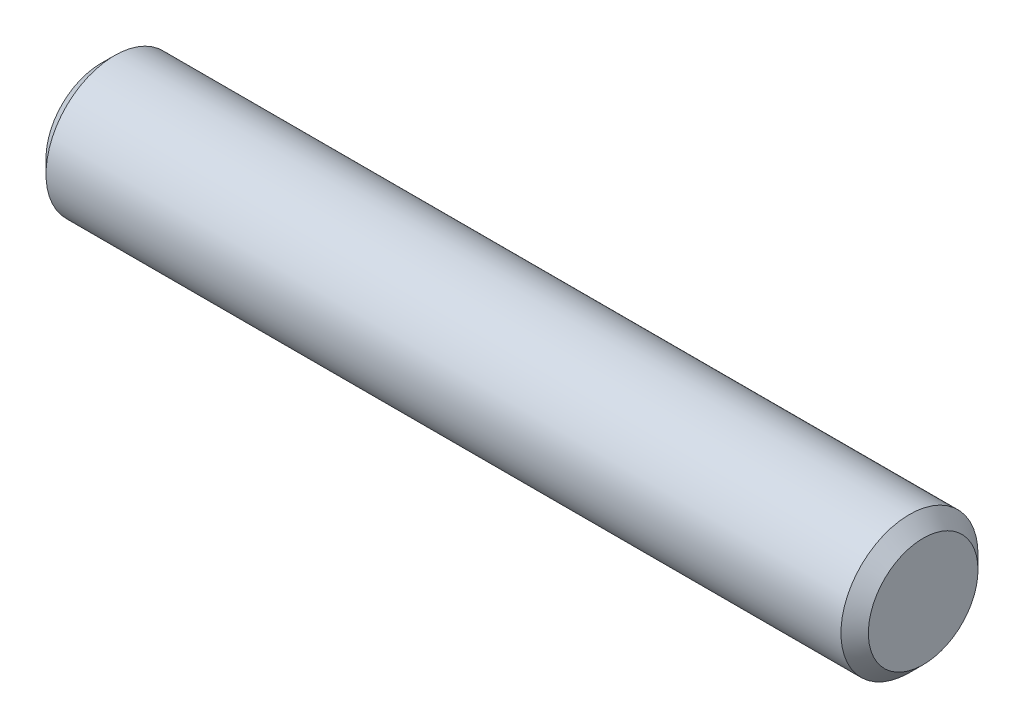
ISO-10303-21;
HEADER;
FILE_DESCRIPTION(('STEP AP214'),'2;1');
FILE_NAME('part.step','',(''),(''),'','','');
FILE_SCHEMA(('AUTOMOTIVE_DESIGN { 1 0 10303 214 1 1 1 1 }'));
ENDSEC;
DATA;
#1=APPLICATION_CONTEXT('core data for automotive mechanical design processes');
#2=APPLICATION_PROTOCOL_DEFINITION('international standard','automotive_design',2000,#1);
#3=PRODUCT_CONTEXT('',#1,'mechanical');
#4=PRODUCT('Part','Part','',(#3));
#5=PRODUCT_RELATED_PRODUCT_CATEGORY('part','',(#4));
#6=PRODUCT_DEFINITION_FORMATION('','',#4);
#7=PRODUCT_DEFINITION_CONTEXT('part definition',#1,'design');
#8=PRODUCT_DEFINITION('design','',#6,#7);
#9=PRODUCT_DEFINITION_SHAPE('','',#8);
#10=(LENGTH_UNIT() NAMED_UNIT(*) SI_UNIT(.MILLI.,.METRE.));
#11=(NAMED_UNIT(*) PLANE_ANGLE_UNIT() SI_UNIT($,.RADIAN.));
#12=(NAMED_UNIT(*) SI_UNIT($,.STERADIAN.) SOLID_ANGLE_UNIT());
#13=UNCERTAINTY_MEASURE_WITH_UNIT(LENGTH_MEASURE(1.E-05),#10,'distance_accuracy_value','');
#14=(GEOMETRIC_REPRESENTATION_CONTEXT(3) GLOBAL_UNCERTAINTY_ASSIGNED_CONTEXT((#13)) GLOBAL_UNIT_ASSIGNED_CONTEXT((#10,
#11,#12)) REPRESENTATION_CONTEXT('',''));
#15=CARTESIAN_POINT('',(0.,0.,0.));
#16=DIRECTION('',(0.,0.,1.));
#17=DIRECTION('',(1.,0.,0.));
#18=AXIS2_PLACEMENT_3D('',#15,#16,#17);
#19=CARTESIAN_POINT('',(-9.525,0.,0.));
#20=DIRECTION('',(1.,0.,0.));
#21=DIRECTION('',(0.,0.,-1.));
#22=AXIS2_PLACEMENT_3D('',#19,#20,#21);
#23=CYLINDRICAL_SURFACE('',#22,1.5875);
#24=CARTESIAN_POINT('',(9.2075,0.,0.));
#25=DIRECTION('',(1.,0.,0.));
#26=DIRECTION('',(0.,0.,-1.));
#27=AXIS2_PLACEMENT_3D('',#24,#25,#26);
#28=CIRCLE('',#27,1.5875);
#29=CARTESIAN_POINT('',(9.2075,0.,-1.5875));
#30=VERTEX_POINT('',#29);
#31=EDGE_CURVE('E39',#30,#30,#28,.F.);
#32=ORIENTED_EDGE('',*,*,#31,.T.);
#33=EDGE_LOOP('',(#32));
#34=FACE_BOUND('',#33,.T.);
#35=CARTESIAN_POINT('',(-9.20750000000001,0.,0.));
#36=DIRECTION('',(1.,0.,0.));
#37=DIRECTION('',(0.,0.,-1.));
#38=AXIS2_PLACEMENT_3D('',#35,#36,#37);
#39=CIRCLE('',#38,1.5875);
#40=CARTESIAN_POINT('',(-9.20750000000001,0.,-1.5875));
#41=VERTEX_POINT('',#40);
#42=EDGE_CURVE('E43',#41,#41,#39,.T.);
#43=ORIENTED_EDGE('',*,*,#42,.T.);
#44=EDGE_LOOP('',(#43));
#45=FACE_BOUND('',#44,.T.);
#46=ADVANCED_FACE('F32',(#34,#45),#23,.T.);
#47=CARTESIAN_POINT('',(-9.525,0.,0.));
#48=DIRECTION('',(1.,0.,0.));
#49=DIRECTION('',(0.,0.,-1.));
#50=AXIS2_PLACEMENT_3D('',#47,#48,#49);
#51=PLANE('',#50);
#52=CARTESIAN_POINT('',(-9.525,0.,0.));
#53=DIRECTION('',(1.,0.,0.));
#54=DIRECTION('',(0.,0.,-1.));
#55=AXIS2_PLACEMENT_3D('',#52,#53,#54);
#56=CIRCLE('',#55,1.27);
#57=CARTESIAN_POINT('',(-9.525,0.,-1.27));
#58=VERTEX_POINT('',#57);
#59=EDGE_CURVE('E10',#58,#58,#56,.F.);
#60=ORIENTED_EDGE('',*,*,#59,.T.);
#61=EDGE_LOOP('',(#60));
#62=FACE_BOUND('',#61,.T.);
#63=ADVANCED_FACE('F63',(#62),#51,.F.);
#64=CARTESIAN_POINT('',(9.525,0.,0.));
#65=DIRECTION('',(1.,0.,0.));
#66=DIRECTION('',(0.,0.,-1.));
#67=AXIS2_PLACEMENT_3D('',#64,#65,#66);
#68=PLANE('',#67);
#69=CARTESIAN_POINT('',(9.525,0.,0.));
#70=DIRECTION('',(1.,0.,0.));
#71=DIRECTION('',(0.,0.,-1.));
#72=AXIS2_PLACEMENT_3D('',#69,#70,#71);
#73=CIRCLE('',#72,1.27);
#74=CARTESIAN_POINT('',(9.525,0.,-1.27));
#75=VERTEX_POINT('',#74);
#76=EDGE_CURVE('E47',#75,#75,#73,.T.);
#77=ORIENTED_EDGE('',*,*,#76,.T.);
#78=EDGE_LOOP('',(#77));
#79=FACE_BOUND('',#78,.T.);
#80=ADVANCED_FACE('F53',(#79),#68,.T.);
#81=CARTESIAN_POINT('',(9.525,0.,0.));
#82=DIRECTION('',(-1.,0.,0.));
#83=DIRECTION('',(0.,0.,1.));
#84=AXIS2_PLACEMENT_3D('',#81,#82,#83);
#85=CONICAL_SURFACE('',#84,1.27,0.78539816339745);
#86=ORIENTED_EDGE('',*,*,#31,.F.);
#87=EDGE_LOOP('',(#86));
#88=FACE_BOUND('',#87,.T.);
#89=ORIENTED_EDGE('',*,*,#76,.F.);
#90=EDGE_LOOP('',(#89));
#91=FACE_BOUND('',#90,.T.);
#92=ADVANCED_FACE('F55',(#88,#91),#85,.T.);
#93=CARTESIAN_POINT('',(-9.20750000000001,0.,0.));
#94=DIRECTION('',(1.,0.,0.));
#95=DIRECTION('',(0.,0.,-1.));
#96=AXIS2_PLACEMENT_3D('',#93,#94,#95);
#97=CONICAL_SURFACE('',#96,1.5875,0.78539816339745);
#98=ORIENTED_EDGE('',*,*,#59,.F.);
#99=EDGE_LOOP('',(#98));
#100=FACE_BOUND('',#99,.T.);
#101=ORIENTED_EDGE('',*,*,#42,.F.);
#102=EDGE_LOOP('',(#101));
#103=FACE_BOUND('',#102,.T.);
#104=ADVANCED_FACE('F34',(#100,#103),#97,.T.);
#105=CLOSED_SHELL('',(#46,#63,#80,#92,#104));
#106=MANIFOLD_SOLID_BREP('B2',#105);
#107=ADVANCED_BREP_SHAPE_REPRESENTATION('',(#18,#106),#14);
#108=SHAPE_DEFINITION_REPRESENTATION(#9,#107);
ENDSEC;
END-ISO-10303-21;
